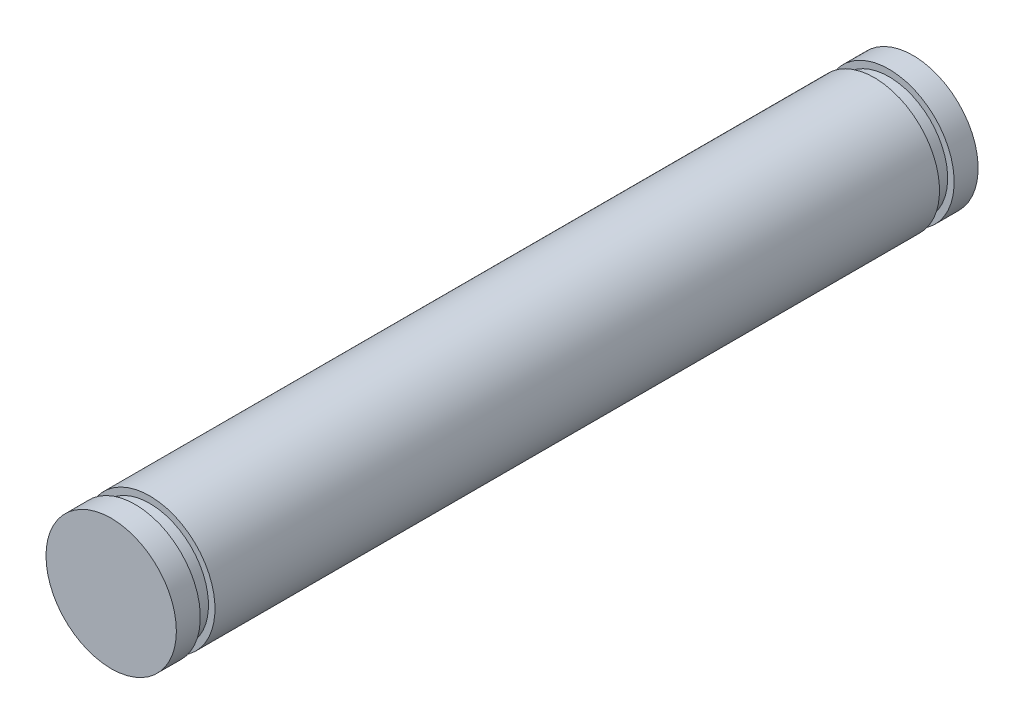
ISO-10303-21;
HEADER;
FILE_DESCRIPTION(('STEP AP214'),'2;1');
FILE_NAME('part.step','',(''),(''),'','','');
FILE_SCHEMA(('AUTOMOTIVE_DESIGN { 1 0 10303 214 1 1 1 1 }'));
ENDSEC;
DATA;
#1=APPLICATION_CONTEXT('core data for automotive mechanical design processes');
#2=APPLICATION_PROTOCOL_DEFINITION('international standard','automotive_design',2000,#1);
#3=PRODUCT_CONTEXT('',#1,'mechanical');
#4=PRODUCT('Part','Part','',(#3));
#5=PRODUCT_RELATED_PRODUCT_CATEGORY('part','',(#4));
#6=PRODUCT_DEFINITION_FORMATION('','',#4);
#7=PRODUCT_DEFINITION_CONTEXT('part definition',#1,'design');
#8=PRODUCT_DEFINITION('design','',#6,#7);
#9=PRODUCT_DEFINITION_SHAPE('','',#8);
#10=(LENGTH_UNIT() NAMED_UNIT(*) SI_UNIT(.MILLI.,.METRE.));
#11=(NAMED_UNIT(*) PLANE_ANGLE_UNIT() SI_UNIT($,.RADIAN.));
#12=(NAMED_UNIT(*) SI_UNIT($,.STERADIAN.) SOLID_ANGLE_UNIT());
#13=UNCERTAINTY_MEASURE_WITH_UNIT(LENGTH_MEASURE(1.E-05),#10,'distance_accuracy_value','');
#14=(GEOMETRIC_REPRESENTATION_CONTEXT(3) GLOBAL_UNCERTAINTY_ASSIGNED_CONTEXT((#13)) GLOBAL_UNIT_ASSIGNED_CONTEXT((#10,
#11,#12)) REPRESENTATION_CONTEXT('',''));
#15=CARTESIAN_POINT('',(0.,0.,0.));
#16=DIRECTION('',(0.,0.,1.));
#17=DIRECTION('',(1.,0.,0.));
#18=AXIS2_PLACEMENT_3D('',#15,#16,#17);
#19=CARTESIAN_POINT('',(0.,0.,50.));
#20=DIRECTION('',(0.,0.,-1.));
#21=DIRECTION('',(-1.,0.,0.));
#22=AXIS2_PLACEMENT_3D('',#19,#20,#21);
#23=CYLINDRICAL_SURFACE('',#22,4.);
#24=CARTESIAN_POINT('',(0.,0.,-22.23));
#25=DIRECTION('',(0.,0.,-1.));
#26=DIRECTION('',(-1.,0.,0.));
#27=AXIS2_PLACEMENT_3D('',#24,#25,#26);
#28=CIRCLE('',#27,4.);
#29=CARTESIAN_POINT('',(-4.,0.,-22.23));
#30=VERTEX_POINT('',#29);
#31=EDGE_CURVE('E56',#30,#30,#28,.T.);
#32=ORIENTED_EDGE('',*,*,#31,.F.);
#33=EDGE_LOOP('',(#32));
#34=FACE_BOUND('',#33,.T.);
#35=CARTESIAN_POINT('',(0.,0.,22.23));
#36=DIRECTION('',(0.,0.,-1.));
#37=DIRECTION('',(-1.,0.,0.));
#38=AXIS2_PLACEMENT_3D('',#35,#36,#37);
#39=CIRCLE('',#38,4.);
#40=CARTESIAN_POINT('',(-4.,0.,22.23));
#41=VERTEX_POINT('',#40);
#42=EDGE_CURVE('E68',#41,#41,#39,.T.);
#43=ORIENTED_EDGE('',*,*,#42,.T.);
#44=EDGE_LOOP('',(#43));
#45=FACE_BOUND('',#44,.T.);
#46=ADVANCED_FACE('F43',(#34,#45),#23,.T.);
#47=CARTESIAN_POINT('',(0.,0.,-23.13));
#48=DIRECTION('',(0.,0.,-1.));
#49=DIRECTION('',(-1.,0.,0.));
#50=AXIS2_PLACEMENT_3D('',#47,#48,#49);
#51=CIRCLE('',#50,4.);
#52=CARTESIAN_POINT('',(-4.,0.,-23.13));
#53=VERTEX_POINT('',#52);
#54=EDGE_CURVE('E54',#53,#53,#51,.T.);
#55=ORIENTED_EDGE('',*,*,#54,.T.);
#56=EDGE_LOOP('',(#55));
#57=FACE_BOUND('',#56,.T.);
#58=CARTESIAN_POINT('',(0.,0.,-24.6));
#59=DIRECTION('',(0.,0.,-1.));
#60=DIRECTION('',(-1.,0.,0.));
#61=AXIS2_PLACEMENT_3D('',#58,#59,#60);
#62=CIRCLE('',#61,4.);
#63=CARTESIAN_POINT('',(-4.,0.,-24.6));
#64=VERTEX_POINT('',#63);
#65=EDGE_CURVE('E47',#64,#64,#62,.T.);
#66=ORIENTED_EDGE('',*,*,#65,.F.);
#67=EDGE_LOOP('',(#66));
#68=FACE_BOUND('',#67,.T.);
#69=ADVANCED_FACE('F45',(#57,#68),#23,.T.);
#70=CARTESIAN_POINT('',(0.,0.,-24.6));
#71=DIRECTION('',(0.,0.,-1.));
#72=DIRECTION('',(-1.,0.,0.));
#73=AXIS2_PLACEMENT_3D('',#70,#71,#72);
#74=PLANE('',#73);
#75=ORIENTED_EDGE('',*,*,#65,.T.);
#76=EDGE_LOOP('',(#75));
#77=FACE_BOUND('',#76,.T.);
#78=ADVANCED_FACE('F100',(#77),#74,.T.);
#79=CARTESIAN_POINT('',(0.,0.,-23.13));
#80=DIRECTION('',(0.,0.,-1.));
#81=DIRECTION('',(-1.,0.,0.));
#82=AXIS2_PLACEMENT_3D('',#79,#80,#81);
#83=PLANE('',#82);
#84=ORIENTED_EDGE('',*,*,#54,.F.);
#85=EDGE_LOOP('',(#84));
#86=FACE_BOUND('',#85,.T.);
#87=CARTESIAN_POINT('',(0.,0.,-23.13));
#88=DIRECTION('',(0.,0.,-1.));
#89=DIRECTION('',(-1.,0.,0.));
#90=AXIS2_PLACEMENT_3D('',#87,#88,#89);
#91=CIRCLE('',#90,3.6);
#92=CARTESIAN_POINT('',(-3.6,0.,-23.13));
#93=VERTEX_POINT('',#92);
#94=EDGE_CURVE('E59',#93,#93,#91,.T.);
#95=ORIENTED_EDGE('',*,*,#94,.T.);
#96=EDGE_LOOP('',(#95));
#97=FACE_BOUND('',#96,.T.);
#98=ADVANCED_FACE('F121',(#86,#97),#83,.F.);
#99=CARTESIAN_POINT('',(0.,0.,-22.23));
#100=DIRECTION('',(0.,0.,-1.));
#101=DIRECTION('',(-1.,0.,0.));
#102=AXIS2_PLACEMENT_3D('',#99,#100,#101);
#103=PLANE('',#102);
#104=ORIENTED_EDGE('',*,*,#31,.T.);
#105=EDGE_LOOP('',(#104));
#106=FACE_BOUND('',#105,.T.);
#107=CARTESIAN_POINT('',(0.,0.,-22.23));
#108=DIRECTION('',(0.,0.,-1.));
#109=DIRECTION('',(-1.,0.,0.));
#110=AXIS2_PLACEMENT_3D('',#107,#108,#109);
#111=CIRCLE('',#110,3.6);
#112=CARTESIAN_POINT('',(-3.6,0.,-22.23));
#113=VERTEX_POINT('',#112);
#114=EDGE_CURVE('E62',#113,#113,#111,.T.);
#115=ORIENTED_EDGE('',*,*,#114,.F.);
#116=EDGE_LOOP('',(#115));
#117=FACE_BOUND('',#116,.T.);
#118=ADVANCED_FACE('F119',(#106,#117),#103,.T.);
#119=CARTESIAN_POINT('',(0.,0.,-23.13));
#120=DIRECTION('',(0.,0.,1.));
#121=DIRECTION('',(1.,0.,0.));
#122=AXIS2_PLACEMENT_3D('',#119,#120,#121);
#123=CYLINDRICAL_SURFACE('',#122,3.6);
#124=ORIENTED_EDGE('',*,*,#94,.F.);
#125=EDGE_LOOP('',(#124));
#126=FACE_BOUND('',#125,.T.);
#127=ORIENTED_EDGE('',*,*,#114,.T.);
#128=EDGE_LOOP('',(#127));
#129=FACE_BOUND('',#128,.T.);
#130=ADVANCED_FACE('F87',(#126,#129),#123,.T.);
#131=CARTESIAN_POINT('',(0.,0.,23.13));
#132=DIRECTION('',(0.,0.,1.));
#133=DIRECTION('',(-1.,0.,0.));
#134=AXIS2_PLACEMENT_3D('',#131,#132,#133);
#135=PLANE('',#134);
#136=CARTESIAN_POINT('',(0.,0.,23.13));
#137=DIRECTION('',(0.,0.,-1.));
#138=DIRECTION('',(-1.,0.,0.));
#139=AXIS2_PLACEMENT_3D('',#136,#137,#138);
#140=CIRCLE('',#139,3.6);
#141=CARTESIAN_POINT('',(-3.6,0.,23.13));
#142=VERTEX_POINT('',#141);
#143=EDGE_CURVE('E71',#142,#142,#140,.T.);
#144=ORIENTED_EDGE('',*,*,#143,.F.);
#145=EDGE_LOOP('',(#144));
#146=FACE_BOUND('',#145,.T.);
#147=CARTESIAN_POINT('',(0.,0.,23.13));
#148=DIRECTION('',(0.,0.,-1.));
#149=DIRECTION('',(-1.,0.,0.));
#150=AXIS2_PLACEMENT_3D('',#147,#148,#149);
#151=CIRCLE('',#150,4.);
#152=CARTESIAN_POINT('',(-4.,0.,23.13));
#153=VERTEX_POINT('',#152);
#154=EDGE_CURVE('E65',#153,#153,#151,.T.);
#155=ORIENTED_EDGE('',*,*,#154,.T.);
#156=EDGE_LOOP('',(#155));
#157=FACE_BOUND('',#156,.T.);
#158=ADVANCED_FACE('F83',(#146,#157),#135,.F.);
#159=CARTESIAN_POINT('',(0.,0.,22.23));
#160=DIRECTION('',(0.,0.,1.));
#161=DIRECTION('',(-1.,0.,0.));
#162=AXIS2_PLACEMENT_3D('',#159,#160,#161);
#163=PLANE('',#162);
#164=CARTESIAN_POINT('',(0.,0.,22.23));
#165=DIRECTION('',(0.,0.,-1.));
#166=DIRECTION('',(-1.,0.,0.));
#167=AXIS2_PLACEMENT_3D('',#164,#165,#166);
#168=CIRCLE('',#167,3.6);
#169=CARTESIAN_POINT('',(-3.6,0.,22.23));
#170=VERTEX_POINT('',#169);
#171=EDGE_CURVE('E74',#170,#170,#168,.T.);
#172=ORIENTED_EDGE('',*,*,#171,.T.);
#173=EDGE_LOOP('',(#172));
#174=FACE_BOUND('',#173,.T.);
#175=ORIENTED_EDGE('',*,*,#42,.F.);
#176=EDGE_LOOP('',(#175));
#177=FACE_BOUND('',#176,.T.);
#178=ADVANCED_FACE('F86',(#174,#177),#163,.T.);
#179=CARTESIAN_POINT('',(0.,0.,23.13));
#180=DIRECTION('',(0.,0.,-1.));
#181=DIRECTION('',(-1.,0.,0.));
#182=AXIS2_PLACEMENT_3D('',#179,#180,#181);
#183=CYLINDRICAL_SURFACE('',#182,3.6);
#184=ORIENTED_EDGE('',*,*,#143,.T.);
#185=EDGE_LOOP('',(#184));
#186=FACE_BOUND('',#185,.T.);
#187=ORIENTED_EDGE('',*,*,#171,.F.);
#188=EDGE_LOOP('',(#187));
#189=FACE_BOUND('',#188,.T.);
#190=ADVANCED_FACE('F80',(#186,#189),#183,.T.);
#191=CARTESIAN_POINT('',(0.,0.,24.6));
#192=DIRECTION('',(0.,0.,1.));
#193=DIRECTION('',(1.,0.,0.));
#194=AXIS2_PLACEMENT_3D('',#191,#192,#193);
#195=PLANE('',#194);
#196=CARTESIAN_POINT('',(0.,0.,24.6));
#197=DIRECTION('',(0.,0.,1.));
#198=DIRECTION('',(1.,0.,0.));
#199=AXIS2_PLACEMENT_3D('',#196,#197,#198);
#200=CIRCLE('',#199,4.);
#201=CARTESIAN_POINT('',(4.,0.,24.6));
#202=VERTEX_POINT('',#201);
#203=EDGE_CURVE('E10',#202,#202,#200,.T.);
#204=ORIENTED_EDGE('',*,*,#203,.T.);
#205=EDGE_LOOP('',(#204));
#206=FACE_BOUND('',#205,.T.);
#207=ADVANCED_FACE('F94',(#206),#195,.T.);
#208=ORIENTED_EDGE('',*,*,#154,.F.);
#209=EDGE_LOOP('',(#208));
#210=FACE_BOUND('',#209,.T.);
#211=ORIENTED_EDGE('',*,*,#203,.F.);
#212=EDGE_LOOP('',(#211));
#213=FACE_BOUND('',#212,.T.);
#214=ADVANCED_FACE('F91',(#210,#213),#23,.T.);
#215=CLOSED_SHELL('',(#46,#69,#78,#98,#118,#130,#158,#178,#190,#207,#214));
#216=MANIFOLD_SOLID_BREP('B2',#215);
#217=ADVANCED_BREP_SHAPE_REPRESENTATION('',(#18,#216),#14);
#218=SHAPE_DEFINITION_REPRESENTATION(#9,#217);
ENDSEC;
END-ISO-10303-21;
